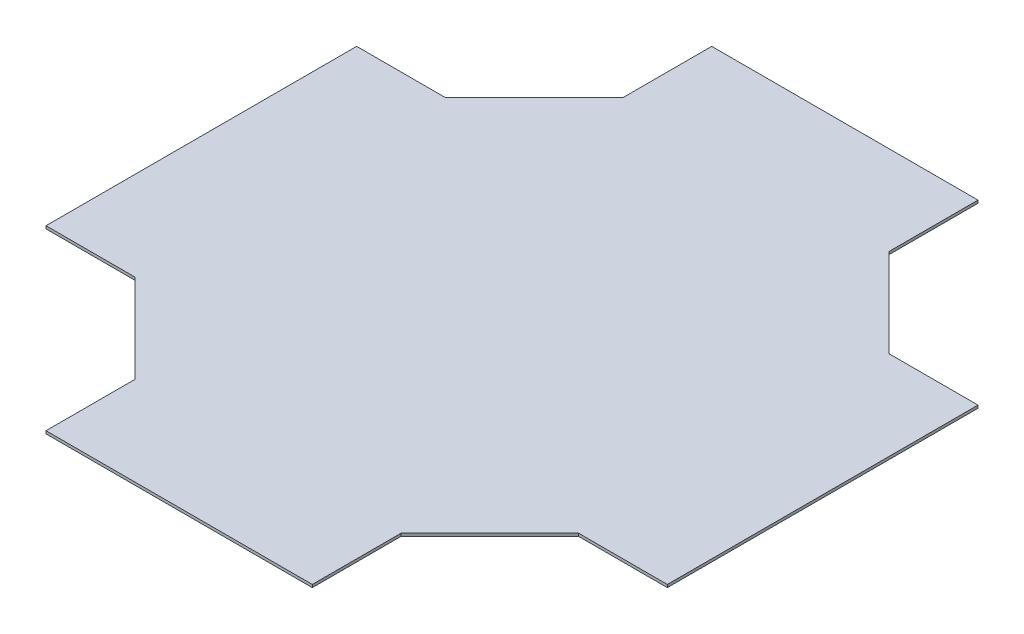
ISO-10303-21;
HEADER;
FILE_DESCRIPTION(('STEP AP214'),'2;1');
FILE_NAME('part.step','',(''),(''),'','','');
FILE_SCHEMA(('AUTOMOTIVE_DESIGN { 1 0 10303 214 1 1 1 1 }'));
ENDSEC;
DATA;
#1=APPLICATION_CONTEXT('core data for automotive mechanical design processes');
#2=APPLICATION_PROTOCOL_DEFINITION('international standard','automotive_design',2000,#1);
#3=PRODUCT_CONTEXT('',#1,'mechanical');
#4=PRODUCT('Part','Part','',(#3));
#5=PRODUCT_RELATED_PRODUCT_CATEGORY('part','',(#4));
#6=PRODUCT_DEFINITION_FORMATION('','',#4);
#7=PRODUCT_DEFINITION_CONTEXT('part definition',#1,'design');
#8=PRODUCT_DEFINITION('design','',#6,#7);
#9=PRODUCT_DEFINITION_SHAPE('','',#8);
#10=(LENGTH_UNIT() NAMED_UNIT(*) SI_UNIT(.MILLI.,.METRE.));
#11=(NAMED_UNIT(*) PLANE_ANGLE_UNIT() SI_UNIT($,.RADIAN.));
#12=(NAMED_UNIT(*) SI_UNIT($,.STERADIAN.) SOLID_ANGLE_UNIT());
#13=UNCERTAINTY_MEASURE_WITH_UNIT(LENGTH_MEASURE(1.E-05),#10,'distance_accuracy_value','');
#14=(GEOMETRIC_REPRESENTATION_CONTEXT(3) GLOBAL_UNCERTAINTY_ASSIGNED_CONTEXT((#13)) GLOBAL_UNIT_ASSIGNED_CONTEXT((#10,
#11,#12)) REPRESENTATION_CONTEXT('',''));
#15=CARTESIAN_POINT('',(0.,0.,0.));
#16=DIRECTION('',(0.,0.,1.));
#17=DIRECTION('',(1.,0.,0.));
#18=AXIS2_PLACEMENT_3D('',#15,#16,#17);
#19=CARTESIAN_POINT('',(0.,1.5875,-177.8));
#20=DIRECTION('',(0.,0.,-1.));
#21=DIRECTION('',(-1.,0.,0.));
#22=AXIS2_PLACEMENT_3D('',#19,#20,#21);
#23=PLANE('',#22);
#24=DIRECTION('',(1.,0.,0.));
#25=VECTOR('',#24,1.);
#26=CARTESIAN_POINT('',(0.,-1.5875,-177.8));
#27=LINE('',#26,#25);
#28=CARTESIAN_POINT('',(254.,-1.5875,-177.8));
#29=VERTEX_POINT('',#28);
#30=CARTESIAN_POINT('',(355.6,-1.5875,-177.8));
#31=VERTEX_POINT('',#30);
#32=EDGE_CURVE('E182',#29,#31,#27,.T.);
#33=ORIENTED_EDGE('',*,*,#32,.F.);
#34=DIRECTION('',(0.,-1.,0.));
#35=VECTOR('',#34,1.);
#36=CARTESIAN_POINT('',(254.,1.5875,-177.8));
#37=LINE('',#36,#35);
#38=CARTESIAN_POINT('',(254.,1.5875,-177.8));
#39=VERTEX_POINT('',#38);
#40=EDGE_CURVE('E11',#39,#29,#37,.T.);
#41=ORIENTED_EDGE('',*,*,#40,.F.);
#42=DIRECTION('',(1.,0.,0.));
#43=VECTOR('',#42,1.);
#44=CARTESIAN_POINT('',(0.,1.5875,-177.8));
#45=LINE('',#44,#43);
#46=CARTESIAN_POINT('',(355.6,1.5875,-177.8));
#47=VERTEX_POINT('',#46);
#48=EDGE_CURVE('E222',#39,#47,#45,.T.);
#49=ORIENTED_EDGE('',*,*,#48,.T.);
#50=DIRECTION('',(0.,-1.,0.));
#51=VECTOR('',#50,1.);
#52=CARTESIAN_POINT('',(355.6,1.5875,-177.8));
#53=LINE('',#52,#51);
#54=EDGE_CURVE('E54',#47,#31,#53,.T.);
#55=ORIENTED_EDGE('',*,*,#54,.T.);
#56=EDGE_LOOP('',(#33,#41,#49,#55));
#57=FACE_BOUND('',#56,.T.);
#58=ADVANCED_FACE('F38',(#57),#23,.T.);
#59=CARTESIAN_POINT('',(215.9,1.5875,-215.9));
#60=DIRECTION('',(-0.707106781186547,0.,0.707106781186548));
#61=DIRECTION('',(0.707106781186548,0.,0.707106781186547));
#62=AXIS2_PLACEMENT_3D('',#59,#60,#61);
#63=PLANE('',#62);
#64=DIRECTION('',(-0.707106781186548,0.,-0.707106781186547));
#65=VECTOR('',#64,1.);
#66=CARTESIAN_POINT('',(215.9,-1.5875,-215.9));
#67=LINE('',#66,#65);
#68=CARTESIAN_POINT('',(152.4,-1.5875,-279.4));
#69=VERTEX_POINT('',#68);
#70=EDGE_CURVE('E184',#29,#69,#67,.T.);
#71=ORIENTED_EDGE('',*,*,#70,.T.);
#72=DIRECTION('',(0.,-1.,0.));
#73=VECTOR('',#72,1.);
#74=CARTESIAN_POINT('',(152.4,1.5875,-279.4));
#75=LINE('',#74,#73);
#76=CARTESIAN_POINT('',(152.4,1.5875,-279.4));
#77=VERTEX_POINT('',#76);
#78=EDGE_CURVE('E46',#77,#69,#75,.T.);
#79=ORIENTED_EDGE('',*,*,#78,.F.);
#80=DIRECTION('',(-0.707106781186548,0.,-0.707106781186547));
#81=VECTOR('',#80,1.);
#82=CARTESIAN_POINT('',(215.9,1.5875,-215.9));
#83=LINE('',#82,#81);
#84=EDGE_CURVE('E274',#39,#77,#83,.T.);
#85=ORIENTED_EDGE('',*,*,#84,.F.);
#86=ORIENTED_EDGE('',*,*,#40,.T.);
#87=EDGE_LOOP('',(#71,#79,#85,#86));
#88=FACE_BOUND('',#87,.T.);
#89=ADVANCED_FACE('F313',(#88),#63,.F.);
#90=CARTESIAN_POINT('',(152.4,1.5875,0.));
#91=DIRECTION('',(-1.,0.,0.));
#92=DIRECTION('',(0.,0.,1.));
#93=AXIS2_PLACEMENT_3D('',#90,#91,#92);
#94=PLANE('',#93);
#95=DIRECTION('',(0.,0.,-1.));
#96=VECTOR('',#95,1.);
#97=CARTESIAN_POINT('',(152.4,-1.5875,0.));
#98=LINE('',#97,#96);
#99=CARTESIAN_POINT('',(152.4,-1.5875,-381.));
#100=VERTEX_POINT('',#99);
#101=EDGE_CURVE('E186',#69,#100,#98,.T.);
#102=ORIENTED_EDGE('',*,*,#101,.T.);
#103=DIRECTION('',(0.,-1.,0.));
#104=VECTOR('',#103,1.);
#105=CARTESIAN_POINT('',(152.4,1.5875,-381.));
#106=LINE('',#105,#104);
#107=CARTESIAN_POINT('',(152.4,1.5875,-381.));
#108=VERTEX_POINT('',#107);
#109=EDGE_CURVE('E246',#108,#100,#106,.T.);
#110=ORIENTED_EDGE('',*,*,#109,.F.);
#111=DIRECTION('',(0.,0.,-1.));
#112=VECTOR('',#111,1.);
#113=CARTESIAN_POINT('',(152.4,1.5875,0.));
#114=LINE('',#113,#112);
#115=EDGE_CURVE('E255',#77,#108,#114,.T.);
#116=ORIENTED_EDGE('',*,*,#115,.F.);
#117=ORIENTED_EDGE('',*,*,#78,.T.);
#118=EDGE_LOOP('',(#102,#110,#116,#117));
#119=FACE_BOUND('',#118,.T.);
#120=ADVANCED_FACE('F253',(#119),#94,.F.);
#121=CARTESIAN_POINT('',(0.,1.5875,-381.));
#122=DIRECTION('',(0.,0.,1.));
#123=DIRECTION('',(1.,0.,0.));
#124=AXIS2_PLACEMENT_3D('',#121,#122,#123);
#125=PLANE('',#124);
#126=DIRECTION('',(-1.,0.,0.));
#127=VECTOR('',#126,1.);
#128=CARTESIAN_POINT('',(0.,-1.5875,-381.));
#129=LINE('',#128,#127);
#130=CARTESIAN_POINT('',(-152.4,-1.5875,-381.));
#131=VERTEX_POINT('',#130);
#132=EDGE_CURVE('E188',#100,#131,#129,.T.);
#133=ORIENTED_EDGE('',*,*,#132,.T.);
#134=DIRECTION('',(0.,-1.,0.));
#135=VECTOR('',#134,1.);
#136=CARTESIAN_POINT('',(-152.4,1.5875,-381.));
#137=LINE('',#136,#135);
#138=CARTESIAN_POINT('',(-152.4,1.5875,-381.));
#139=VERTEX_POINT('',#138);
#140=EDGE_CURVE('E244',#139,#131,#137,.T.);
#141=ORIENTED_EDGE('',*,*,#140,.F.);
#142=DIRECTION('',(-1.,0.,0.));
#143=VECTOR('',#142,1.);
#144=CARTESIAN_POINT('',(0.,1.5875,-381.));
#145=LINE('',#144,#143);
#146=EDGE_CURVE('E268',#108,#139,#145,.T.);
#147=ORIENTED_EDGE('',*,*,#146,.F.);
#148=ORIENTED_EDGE('',*,*,#109,.T.);
#149=EDGE_LOOP('',(#133,#141,#147,#148));
#150=FACE_BOUND('',#149,.T.);
#151=ADVANCED_FACE('F265',(#150),#125,.F.);
#152=CARTESIAN_POINT('',(-152.4,1.5875,0.));
#153=DIRECTION('',(-1.,0.,0.));
#154=DIRECTION('',(0.,0.,1.));
#155=AXIS2_PLACEMENT_3D('',#152,#153,#154);
#156=PLANE('',#155);
#157=DIRECTION('',(0.,0.,-1.));
#158=VECTOR('',#157,1.);
#159=CARTESIAN_POINT('',(-152.4,-1.5875,0.));
#160=LINE('',#159,#158);
#161=CARTESIAN_POINT('',(-152.4,-1.5875,-279.4));
#162=VERTEX_POINT('',#161);
#163=EDGE_CURVE('E191',#162,#131,#160,.T.);
#164=ORIENTED_EDGE('',*,*,#163,.F.);
#165=DIRECTION('',(0.,-1.,0.));
#166=VECTOR('',#165,1.);
#167=CARTESIAN_POINT('',(-152.4,1.5875,-279.4));
#168=LINE('',#167,#166);
#169=CARTESIAN_POINT('',(-152.4,1.5875,-279.4));
#170=VERTEX_POINT('',#169);
#171=EDGE_CURVE('E242',#170,#162,#168,.T.);
#172=ORIENTED_EDGE('',*,*,#171,.F.);
#173=DIRECTION('',(0.,0.,-1.));
#174=VECTOR('',#173,1.);
#175=CARTESIAN_POINT('',(-152.4,1.5875,0.));
#176=LINE('',#175,#174);
#177=EDGE_CURVE('E270',#170,#139,#176,.T.);
#178=ORIENTED_EDGE('',*,*,#177,.T.);
#179=ORIENTED_EDGE('',*,*,#140,.T.);
#180=EDGE_LOOP('',(#164,#172,#178,#179));
#181=FACE_BOUND('',#180,.T.);
#182=ADVANCED_FACE('F421',(#181),#156,.T.);
#183=CARTESIAN_POINT('',(-215.9,1.5875,-215.9));
#184=DIRECTION('',(0.707106781186548,0.,0.707106781186547));
#185=DIRECTION('',(0.707106781186547,0.,-0.707106781186548));
#186=AXIS2_PLACEMENT_3D('',#183,#184,#185);
#187=PLANE('',#186);
#188=DIRECTION('',(-0.707106781186547,0.,0.707106781186548));
#189=VECTOR('',#188,1.);
#190=CARTESIAN_POINT('',(-215.9,-1.5875,-215.9));
#191=LINE('',#190,#189);
#192=CARTESIAN_POINT('',(-254.,-1.5875,-177.8));
#193=VERTEX_POINT('',#192);
#194=EDGE_CURVE('E194',#162,#193,#191,.T.);
#195=ORIENTED_EDGE('',*,*,#194,.T.);
#196=DIRECTION('',(0.,-1.,0.));
#197=VECTOR('',#196,1.);
#198=CARTESIAN_POINT('',(-254.,1.5875,-177.8));
#199=LINE('',#198,#197);
#200=CARTESIAN_POINT('',(-254.,1.5875,-177.8));
#201=VERTEX_POINT('',#200);
#202=EDGE_CURVE('E240',#201,#193,#199,.T.);
#203=ORIENTED_EDGE('',*,*,#202,.F.);
#204=DIRECTION('',(-0.707106781186547,0.,0.707106781186548));
#205=VECTOR('',#204,1.);
#206=CARTESIAN_POINT('',(-215.9,1.5875,-215.9));
#207=LINE('',#206,#205);
#208=EDGE_CURVE('E272',#170,#201,#207,.T.);
#209=ORIENTED_EDGE('',*,*,#208,.F.);
#210=ORIENTED_EDGE('',*,*,#171,.T.);
#211=EDGE_LOOP('',(#195,#203,#209,#210));
#212=FACE_BOUND('',#211,.T.);
#213=ADVANCED_FACE('F411',(#212),#187,.F.);
#214=CARTESIAN_POINT('',(0.,1.5875,-177.8));
#215=DIRECTION('',(0.,0.,-1.));
#216=DIRECTION('',(-1.,0.,0.));
#217=AXIS2_PLACEMENT_3D('',#214,#215,#216);
#218=PLANE('',#217);
#219=DIRECTION('',(1.,0.,0.));
#220=VECTOR('',#219,1.);
#221=CARTESIAN_POINT('',(0.,-1.5875,-177.8));
#222=LINE('',#221,#220);
#223=CARTESIAN_POINT('',(-355.6,-1.5875,-177.8));
#224=VERTEX_POINT('',#223);
#225=EDGE_CURVE('E197',#224,#193,#222,.T.);
#226=ORIENTED_EDGE('',*,*,#225,.F.);
#227=DIRECTION('',(0.,-1.,0.));
#228=VECTOR('',#227,1.);
#229=CARTESIAN_POINT('',(-355.6,1.5875,-177.8));
#230=LINE('',#229,#228);
#231=CARTESIAN_POINT('',(-355.6,1.5875,-177.8));
#232=VERTEX_POINT('',#231);
#233=EDGE_CURVE('E238',#232,#224,#230,.T.);
#234=ORIENTED_EDGE('',*,*,#233,.F.);
#235=DIRECTION('',(1.,0.,0.));
#236=VECTOR('',#235,1.);
#237=CARTESIAN_POINT('',(0.,1.5875,-177.8));
#238=LINE('',#237,#236);
#239=EDGE_CURVE('E279',#232,#201,#238,.T.);
#240=ORIENTED_EDGE('',*,*,#239,.T.);
#241=ORIENTED_EDGE('',*,*,#202,.T.);
#242=EDGE_LOOP('',(#226,#234,#240,#241));
#243=FACE_BOUND('',#242,.T.);
#244=ADVANCED_FACE('F401',(#243),#218,.T.);
#245=CARTESIAN_POINT('',(-355.6,1.5875,0.));
#246=DIRECTION('',(1.,0.,0.));
#247=DIRECTION('',(0.,0.,-1.));
#248=AXIS2_PLACEMENT_3D('',#245,#246,#247);
#249=PLANE('',#248);
#250=DIRECTION('',(0.,0.,1.));
#251=VECTOR('',#250,1.);
#252=CARTESIAN_POINT('',(-355.6,-1.5875,0.));
#253=LINE('',#252,#251);
#254=CARTESIAN_POINT('',(-355.6,-1.5875,177.8));
#255=VERTEX_POINT('',#254);
#256=EDGE_CURVE('E200',#224,#255,#253,.T.);
#257=ORIENTED_EDGE('',*,*,#256,.T.);
#258=DIRECTION('',(0.,-1.,0.));
#259=VECTOR('',#258,1.);
#260=CARTESIAN_POINT('',(-355.6,1.5875,177.8));
#261=LINE('',#260,#259);
#262=CARTESIAN_POINT('',(-355.6,1.5875,177.8));
#263=VERTEX_POINT('',#262);
#264=EDGE_CURVE('E235',#263,#255,#261,.T.);
#265=ORIENTED_EDGE('',*,*,#264,.F.);
#266=DIRECTION('',(0.,0.,1.));
#267=VECTOR('',#266,1.);
#268=CARTESIAN_POINT('',(-355.6,1.5875,0.));
#269=LINE('',#268,#267);
#270=EDGE_CURVE('E282',#232,#263,#269,.T.);
#271=ORIENTED_EDGE('',*,*,#270,.F.);
#272=ORIENTED_EDGE('',*,*,#233,.T.);
#273=EDGE_LOOP('',(#257,#265,#271,#272));
#274=FACE_BOUND('',#273,.T.);
#275=ADVANCED_FACE('F391',(#274),#249,.F.);
#276=CARTESIAN_POINT('',(0.,1.5875,177.8));
#277=DIRECTION('',(0.,0.,-1.));
#278=DIRECTION('',(-1.,0.,0.));
#279=AXIS2_PLACEMENT_3D('',#276,#277,#278);
#280=PLANE('',#279);
#281=DIRECTION('',(1.,0.,0.));
#282=VECTOR('',#281,1.);
#283=CARTESIAN_POINT('',(0.,-1.5875,177.8));
#284=LINE('',#283,#282);
#285=CARTESIAN_POINT('',(-254.,-1.5875,177.8));
#286=VERTEX_POINT('',#285);
#287=EDGE_CURVE('E202',#255,#286,#284,.T.);
#288=ORIENTED_EDGE('',*,*,#287,.T.);
#289=DIRECTION('',(0.,-1.,0.));
#290=VECTOR('',#289,1.);
#291=CARTESIAN_POINT('',(-254.,1.5875,177.8));
#292=LINE('',#291,#290);
#293=CARTESIAN_POINT('',(-254.,1.5875,177.8));
#294=VERTEX_POINT('',#293);
#295=EDGE_CURVE('E232',#294,#286,#292,.T.);
#296=ORIENTED_EDGE('',*,*,#295,.F.);
#297=DIRECTION('',(1.,0.,0.));
#298=VECTOR('',#297,1.);
#299=CARTESIAN_POINT('',(0.,1.5875,177.8));
#300=LINE('',#299,#298);
#301=EDGE_CURVE('E284',#263,#294,#300,.T.);
#302=ORIENTED_EDGE('',*,*,#301,.F.);
#303=ORIENTED_EDGE('',*,*,#264,.T.);
#304=EDGE_LOOP('',(#288,#296,#302,#303));
#305=FACE_BOUND('',#304,.T.);
#306=ADVANCED_FACE('F381',(#305),#280,.F.);
#307=CARTESIAN_POINT('',(-215.9,1.5875,215.9));
#308=DIRECTION('',(0.707106781186548,0.,-0.707106781186548));
#309=DIRECTION('',(-0.707106781186548,0.,-0.707106781186548));
#310=AXIS2_PLACEMENT_3D('',#307,#308,#309);
#311=PLANE('',#310);
#312=DIRECTION('',(0.707106781186548,0.,0.707106781186548));
#313=VECTOR('',#312,1.);
#314=CARTESIAN_POINT('',(-215.9,-1.5875,215.9));
#315=LINE('',#314,#313);
#316=CARTESIAN_POINT('',(-152.4,-1.5875,279.4));
#317=VERTEX_POINT('',#316);
#318=EDGE_CURVE('E204',#286,#317,#315,.T.);
#319=ORIENTED_EDGE('',*,*,#318,.T.);
#320=DIRECTION('',(0.,-1.,0.));
#321=VECTOR('',#320,1.);
#322=CARTESIAN_POINT('',(-152.4,1.5875,279.4));
#323=LINE('',#322,#321);
#324=CARTESIAN_POINT('',(-152.4,1.5875,279.4));
#325=VERTEX_POINT('',#324);
#326=EDGE_CURVE('E230',#325,#317,#323,.T.);
#327=ORIENTED_EDGE('',*,*,#326,.F.);
#328=DIRECTION('',(0.707106781186548,0.,0.707106781186548));
#329=VECTOR('',#328,1.);
#330=CARTESIAN_POINT('',(-215.9,1.5875,215.9));
#331=LINE('',#330,#329);
#332=EDGE_CURVE('E286',#294,#325,#331,.T.);
#333=ORIENTED_EDGE('',*,*,#332,.F.);
#334=ORIENTED_EDGE('',*,*,#295,.T.);
#335=EDGE_LOOP('',(#319,#327,#333,#334));
#336=FACE_BOUND('',#335,.T.);
#337=ADVANCED_FACE('F372',(#336),#311,.F.);
#338=CARTESIAN_POINT('',(-152.4,1.5875,0.));
#339=DIRECTION('',(-1.,0.,0.));
#340=DIRECTION('',(0.,0.,1.));
#341=AXIS2_PLACEMENT_3D('',#338,#339,#340);
#342=PLANE('',#341);
#343=DIRECTION('',(0.,0.,-1.));
#344=VECTOR('',#343,1.);
#345=CARTESIAN_POINT('',(-152.4,-1.5875,0.));
#346=LINE('',#345,#344);
#347=CARTESIAN_POINT('',(-152.4,-1.5875,381.));
#348=VERTEX_POINT('',#347);
#349=EDGE_CURVE('E207',#348,#317,#346,.T.);
#350=ORIENTED_EDGE('',*,*,#349,.F.);
#351=DIRECTION('',(0.,-1.,0.));
#352=VECTOR('',#351,1.);
#353=CARTESIAN_POINT('',(-152.4,1.5875,381.));
#354=LINE('',#353,#352);
#355=CARTESIAN_POINT('',(-152.4,1.5875,381.));
#356=VERTEX_POINT('',#355);
#357=EDGE_CURVE('E228',#356,#348,#354,.T.);
#358=ORIENTED_EDGE('',*,*,#357,.F.);
#359=DIRECTION('',(0.,0.,-1.));
#360=VECTOR('',#359,1.);
#361=CARTESIAN_POINT('',(-152.4,1.5875,0.));
#362=LINE('',#361,#360);
#363=EDGE_CURVE('E288',#356,#325,#362,.T.);
#364=ORIENTED_EDGE('',*,*,#363,.T.);
#365=ORIENTED_EDGE('',*,*,#326,.T.);
#366=EDGE_LOOP('',(#350,#358,#364,#365));
#367=FACE_BOUND('',#366,.T.);
#368=ADVANCED_FACE('F299',(#367),#342,.T.);
#369=CARTESIAN_POINT('',(1.38777878078145E-13,1.5875,381.));
#370=DIRECTION('',(0.,0.,1.));
#371=DIRECTION('',(1.,0.,0.));
#372=AXIS2_PLACEMENT_3D('',#369,#370,#371);
#373=PLANE('',#372);
#374=DIRECTION('',(-1.,0.,0.));
#375=VECTOR('',#374,1.);
#376=CARTESIAN_POINT('',(1.38777878078145E-13,-1.5875,381.));
#377=LINE('',#376,#375);
#378=CARTESIAN_POINT('',(152.4,-1.5875,381.));
#379=VERTEX_POINT('',#378);
#380=EDGE_CURVE('E210',#379,#348,#377,.T.);
#381=ORIENTED_EDGE('',*,*,#380,.F.);
#382=DIRECTION('',(0.,-1.,0.));
#383=VECTOR('',#382,1.);
#384=CARTESIAN_POINT('',(152.4,1.5875,381.));
#385=LINE('',#384,#383);
#386=CARTESIAN_POINT('',(152.4,1.5875,381.));
#387=VERTEX_POINT('',#386);
#388=EDGE_CURVE('E226',#387,#379,#385,.T.);
#389=ORIENTED_EDGE('',*,*,#388,.F.);
#390=DIRECTION('',(-1.,0.,0.));
#391=VECTOR('',#390,1.);
#392=CARTESIAN_POINT('',(1.38777878078145E-13,1.5875,381.));
#393=LINE('',#392,#391);
#394=EDGE_CURVE('E177',#387,#356,#393,.T.);
#395=ORIENTED_EDGE('',*,*,#394,.T.);
#396=ORIENTED_EDGE('',*,*,#357,.T.);
#397=EDGE_LOOP('',(#381,#389,#395,#396));
#398=FACE_BOUND('',#397,.T.);
#399=ADVANCED_FACE('F293',(#398),#373,.T.);
#400=CARTESIAN_POINT('',(152.4,1.5875,0.));
#401=DIRECTION('',(-1.,0.,0.));
#402=DIRECTION('',(0.,0.,1.));
#403=AXIS2_PLACEMENT_3D('',#400,#401,#402);
#404=PLANE('',#403);
#405=DIRECTION('',(0.,0.,-1.));
#406=VECTOR('',#405,1.);
#407=CARTESIAN_POINT('',(152.4,-1.5875,0.));
#408=LINE('',#407,#406);
#409=CARTESIAN_POINT('',(152.4,-1.5875,279.4));
#410=VERTEX_POINT('',#409);
#411=EDGE_CURVE('E213',#379,#410,#408,.T.);
#412=ORIENTED_EDGE('',*,*,#411,.T.);
#413=DIRECTION('',(0.,-1.,0.));
#414=VECTOR('',#413,1.);
#415=CARTESIAN_POINT('',(152.4,1.5875,279.4));
#416=LINE('',#415,#414);
#417=CARTESIAN_POINT('',(152.4,1.5875,279.4));
#418=VERTEX_POINT('',#417);
#419=EDGE_CURVE('E162',#418,#410,#416,.T.);
#420=ORIENTED_EDGE('',*,*,#419,.F.);
#421=DIRECTION('',(0.,0.,-1.));
#422=VECTOR('',#421,1.);
#423=CARTESIAN_POINT('',(152.4,1.5875,0.));
#424=LINE('',#423,#422);
#425=EDGE_CURVE('E174',#387,#418,#424,.T.);
#426=ORIENTED_EDGE('',*,*,#425,.F.);
#427=ORIENTED_EDGE('',*,*,#388,.T.);
#428=EDGE_LOOP('',(#412,#420,#426,#427));
#429=FACE_BOUND('',#428,.T.);
#430=ADVANCED_FACE('F303',(#429),#404,.F.);
#431=CARTESIAN_POINT('',(215.9,1.5875,215.9));
#432=DIRECTION('',(0.707106781186547,0.,0.707106781186548));
#433=DIRECTION('',(0.707106781186548,0.,-0.707106781186547));
#434=AXIS2_PLACEMENT_3D('',#431,#432,#433);
#435=PLANE('',#434);
#436=DIRECTION('',(-0.707106781186548,0.,0.707106781186547));
#437=VECTOR('',#436,1.);
#438=CARTESIAN_POINT('',(215.9,-1.5875,215.9));
#439=LINE('',#438,#437);
#440=CARTESIAN_POINT('',(254.,-1.5875,177.8));
#441=VERTEX_POINT('',#440);
#442=EDGE_CURVE('E159',#441,#410,#439,.T.);
#443=ORIENTED_EDGE('',*,*,#442,.F.);
#444=DIRECTION('',(0.,-1.,0.));
#445=VECTOR('',#444,1.);
#446=CARTESIAN_POINT('',(254.,1.5875,177.8));
#447=LINE('',#446,#445);
#448=CARTESIAN_POINT('',(254.,1.5875,177.8));
#449=VERTEX_POINT('',#448);
#450=EDGE_CURVE('E153',#449,#441,#447,.T.);
#451=ORIENTED_EDGE('',*,*,#450,.F.);
#452=DIRECTION('',(-0.707106781186548,0.,0.707106781186547));
#453=VECTOR('',#452,1.);
#454=CARTESIAN_POINT('',(215.9,1.5875,215.9));
#455=LINE('',#454,#453);
#456=EDGE_CURVE('E157',#449,#418,#455,.T.);
#457=ORIENTED_EDGE('',*,*,#456,.T.);
#458=ORIENTED_EDGE('',*,*,#419,.T.);
#459=EDGE_LOOP('',(#443,#451,#457,#458));
#460=FACE_BOUND('',#459,.T.);
#461=ADVANCED_FACE('F155',(#460),#435,.T.);
#462=CARTESIAN_POINT('',(0.,1.5875,177.8));
#463=DIRECTION('',(0.,0.,-1.));
#464=DIRECTION('',(-1.,0.,0.));
#465=AXIS2_PLACEMENT_3D('',#462,#463,#464);
#466=PLANE('',#465);
#467=DIRECTION('',(1.,0.,0.));
#468=VECTOR('',#467,1.);
#469=CARTESIAN_POINT('',(0.,-1.5875,177.8));
#470=LINE('',#469,#468);
#471=CARTESIAN_POINT('',(355.6,-1.5875,177.8));
#472=VERTEX_POINT('',#471);
#473=EDGE_CURVE('E217',#441,#472,#470,.T.);
#474=ORIENTED_EDGE('',*,*,#473,.T.);
#475=DIRECTION('',(0.,-1.,0.));
#476=VECTOR('',#475,1.);
#477=CARTESIAN_POINT('',(355.6,1.5875,177.8));
#478=LINE('',#477,#476);
#479=CARTESIAN_POINT('',(355.6,1.5875,177.8));
#480=VERTEX_POINT('',#479);
#481=EDGE_CURVE('E104',#480,#472,#478,.T.);
#482=ORIENTED_EDGE('',*,*,#481,.F.);
#483=DIRECTION('',(1.,0.,0.));
#484=VECTOR('',#483,1.);
#485=CARTESIAN_POINT('',(0.,1.5875,177.8));
#486=LINE('',#485,#484);
#487=EDGE_CURVE('E164',#449,#480,#486,.T.);
#488=ORIENTED_EDGE('',*,*,#487,.F.);
#489=ORIENTED_EDGE('',*,*,#450,.T.);
#490=EDGE_LOOP('',(#474,#482,#488,#489));
#491=FACE_BOUND('',#490,.T.);
#492=ADVANCED_FACE('F165',(#491),#466,.F.);
#493=CARTESIAN_POINT('',(355.6,1.5875,0.));
#494=DIRECTION('',(1.,0.,0.));
#495=DIRECTION('',(0.,0.,-1.));
#496=AXIS2_PLACEMENT_3D('',#493,#494,#495);
#497=PLANE('',#496);
#498=DIRECTION('',(0.,0.,1.));
#499=VECTOR('',#498,1.);
#500=CARTESIAN_POINT('',(355.6,-1.5875,0.));
#501=LINE('',#500,#499);
#502=EDGE_CURVE('E219',#31,#472,#501,.T.);
#503=ORIENTED_EDGE('',*,*,#502,.F.);
#504=ORIENTED_EDGE('',*,*,#54,.F.);
#505=DIRECTION('',(0.,0.,1.));
#506=VECTOR('',#505,1.);
#507=CARTESIAN_POINT('',(355.6,1.5875,0.));
#508=LINE('',#507,#506);
#509=EDGE_CURVE('E168',#47,#480,#508,.T.);
#510=ORIENTED_EDGE('',*,*,#509,.T.);
#511=ORIENTED_EDGE('',*,*,#481,.T.);
#512=EDGE_LOOP('',(#503,#504,#510,#511));
#513=FACE_BOUND('',#512,.T.);
#514=ADVANCED_FACE('F317',(#513),#497,.T.);
#515=CARTESIAN_POINT('',(0.,1.5875,0.));
#516=DIRECTION('',(0.,1.,0.));
#517=DIRECTION('',(0.,0.,1.));
#518=AXIS2_PLACEMENT_3D('',#515,#516,#517);
#519=PLANE('',#518);
#520=ORIENTED_EDGE('',*,*,#48,.F.);
#521=ORIENTED_EDGE('',*,*,#84,.T.);
#522=ORIENTED_EDGE('',*,*,#115,.T.);
#523=ORIENTED_EDGE('',*,*,#146,.T.);
#524=ORIENTED_EDGE('',*,*,#177,.F.);
#525=ORIENTED_EDGE('',*,*,#208,.T.);
#526=ORIENTED_EDGE('',*,*,#239,.F.);
#527=ORIENTED_EDGE('',*,*,#270,.T.);
#528=ORIENTED_EDGE('',*,*,#301,.T.);
#529=ORIENTED_EDGE('',*,*,#332,.T.);
#530=ORIENTED_EDGE('',*,*,#363,.F.);
#531=ORIENTED_EDGE('',*,*,#394,.F.);
#532=ORIENTED_EDGE('',*,*,#425,.T.);
#533=ORIENTED_EDGE('',*,*,#456,.F.);
#534=ORIENTED_EDGE('',*,*,#487,.T.);
#535=ORIENTED_EDGE('',*,*,#509,.F.);
#536=EDGE_LOOP('',(#520,#521,#522,#523,#524,#525,#526,#527,#528,#529,#530,#531,#532,#533,#534,#535));
#537=FACE_BOUND('',#536,.T.);
#538=ADVANCED_FACE('F171',(#537),#519,.T.);
#539=CARTESIAN_POINT('',(0.,-1.5875,0.));
#540=DIRECTION('',(0.,1.,0.));
#541=DIRECTION('',(0.,0.,1.));
#542=AXIS2_PLACEMENT_3D('',#539,#540,#541);
#543=PLANE('',#542);
#544=ORIENTED_EDGE('',*,*,#32,.T.);
#545=ORIENTED_EDGE('',*,*,#502,.T.);
#546=ORIENTED_EDGE('',*,*,#473,.F.);
#547=ORIENTED_EDGE('',*,*,#442,.T.);
#548=ORIENTED_EDGE('',*,*,#411,.F.);
#549=ORIENTED_EDGE('',*,*,#380,.T.);
#550=ORIENTED_EDGE('',*,*,#349,.T.);
#551=ORIENTED_EDGE('',*,*,#318,.F.);
#552=ORIENTED_EDGE('',*,*,#287,.F.);
#553=ORIENTED_EDGE('',*,*,#256,.F.);
#554=ORIENTED_EDGE('',*,*,#225,.T.);
#555=ORIENTED_EDGE('',*,*,#194,.F.);
#556=ORIENTED_EDGE('',*,*,#163,.T.);
#557=ORIENTED_EDGE('',*,*,#132,.F.);
#558=ORIENTED_EDGE('',*,*,#101,.F.);
#559=ORIENTED_EDGE('',*,*,#70,.F.);
#560=EDGE_LOOP('',(#544,#545,#546,#547,#548,#549,#550,#551,#552,#553,#554,#555,#556,#557,#558,#559));
#561=FACE_BOUND('',#560,.T.);
#562=ADVANCED_FACE('F260',(#561),#543,.F.);
#563=CLOSED_SHELL('',(#58,#89,#120,#151,#182,#213,#244,#275,#306,#337,#368,#399,#430,#461,#492,
#514,#538,#562));
#564=MANIFOLD_SOLID_BREP('B2',#563);
#565=ADVANCED_BREP_SHAPE_REPRESENTATION('',(#18,#564),#14);
#566=SHAPE_DEFINITION_REPRESENTATION(#9,#565);
ENDSEC;
END-ISO-10303-21;
